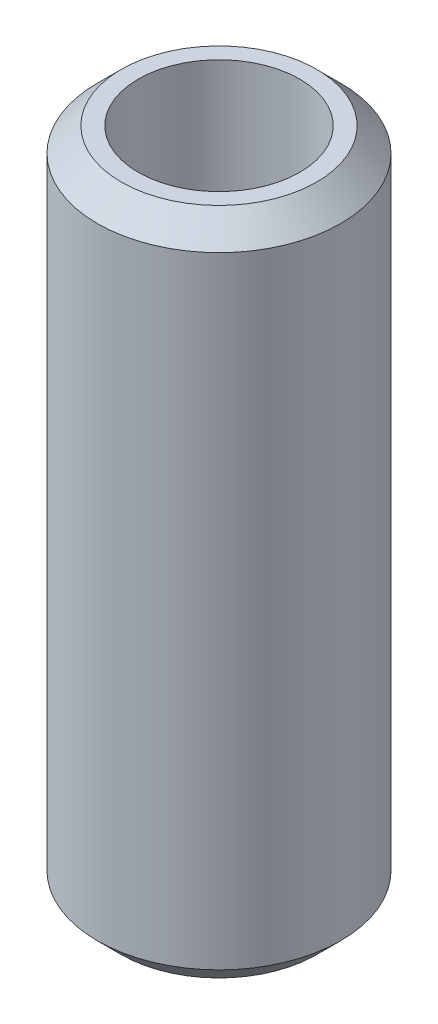
ISO-10303-21;
HEADER;
FILE_DESCRIPTION(('STEP AP214'),'2;1');
FILE_NAME('part.step','',(''),(''),'','','');
FILE_SCHEMA(('AUTOMOTIVE_DESIGN { 1 0 10303 214 1 1 1 1 }'));
ENDSEC;
DATA;
#1=APPLICATION_CONTEXT('core data for automotive mechanical design processes');
#2=APPLICATION_PROTOCOL_DEFINITION('international standard','automotive_design',2000,#1);
#3=PRODUCT_CONTEXT('',#1,'mechanical');
#4=PRODUCT('Part','Part','',(#3));
#5=PRODUCT_RELATED_PRODUCT_CATEGORY('part','',(#4));
#6=PRODUCT_DEFINITION_FORMATION('','',#4);
#7=PRODUCT_DEFINITION_CONTEXT('part definition',#1,'design');
#8=PRODUCT_DEFINITION('design','',#6,#7);
#9=PRODUCT_DEFINITION_SHAPE('','',#8);
#10=(LENGTH_UNIT() NAMED_UNIT(*) SI_UNIT(.MILLI.,.METRE.));
#11=(NAMED_UNIT(*) PLANE_ANGLE_UNIT() SI_UNIT($,.RADIAN.));
#12=(NAMED_UNIT(*) SI_UNIT($,.STERADIAN.) SOLID_ANGLE_UNIT());
#13=UNCERTAINTY_MEASURE_WITH_UNIT(LENGTH_MEASURE(1.E-05),#10,'distance_accuracy_value','');
#14=(GEOMETRIC_REPRESENTATION_CONTEXT(3) GLOBAL_UNCERTAINTY_ASSIGNED_CONTEXT((#13)) GLOBAL_UNIT_ASSIGNED_CONTEXT((#10,
#11,#12)) REPRESENTATION_CONTEXT('',''));
#15=CARTESIAN_POINT('',(0.,0.,0.));
#16=DIRECTION('',(0.,0.,1.));
#17=DIRECTION('',(1.,0.,0.));
#18=AXIS2_PLACEMENT_3D('',#15,#16,#17);
#19=CARTESIAN_POINT('',(0.,34.925,0.));
#20=DIRECTION('',(0.,1.,0.));
#21=DIRECTION('',(0.,0.,1.));
#22=AXIS2_PLACEMENT_3D('',#19,#20,#21);
#23=PLANE('',#22);
#24=CARTESIAN_POINT('',(0.,34.925,0.));
#25=DIRECTION('',(0.,1.,0.));
#26=DIRECTION('',(0.,0.,1.));
#27=AXIS2_PLACEMENT_3D('',#24,#25,#26);
#28=CIRCLE('',#27,10.2);
#29=CARTESIAN_POINT('',(0.,34.925,10.2));
#30=VERTEX_POINT('',#29);
#31=EDGE_CURVE('E10',#30,#30,#28,.T.);
#32=ORIENTED_EDGE('',*,*,#31,.T.);
#33=EDGE_LOOP('',(#32));
#34=FACE_BOUND('',#33,.T.);
#35=CARTESIAN_POINT('',(0.,34.925,0.));
#36=DIRECTION('',(0.,1.,0.));
#37=DIRECTION('',(0.,0.,1.));
#38=AXIS2_PLACEMENT_3D('',#35,#36,#37);
#39=CIRCLE('',#38,8.43397683397684);
#40=CARTESIAN_POINT('',(0.,34.925,8.43397683397684));
#41=VERTEX_POINT('',#40);
#42=EDGE_CURVE('E60',#41,#41,#39,.T.);
#43=ORIENTED_EDGE('',*,*,#42,.F.);
#44=EDGE_LOOP('',(#43));
#45=FACE_BOUND('',#44,.T.);
#46=ADVANCED_FACE('F39',(#34,#45),#23,.T.);
#47=CARTESIAN_POINT('',(0.,-34.925,0.));
#48=DIRECTION('',(0.,1.,0.));
#49=DIRECTION('',(0.,0.,1.));
#50=AXIS2_PLACEMENT_3D('',#47,#48,#49);
#51=PLANE('',#50);
#52=CARTESIAN_POINT('',(0.,-34.925,0.));
#53=DIRECTION('',(0.,1.,0.));
#54=DIRECTION('',(0.,0.,1.));
#55=AXIS2_PLACEMENT_3D('',#52,#53,#54);
#56=CIRCLE('',#55,10.2);
#57=CARTESIAN_POINT('',(0.,-34.925,10.2));
#58=VERTEX_POINT('',#57);
#59=EDGE_CURVE('E47',#58,#58,#56,.F.);
#60=ORIENTED_EDGE('',*,*,#59,.T.);
#61=EDGE_LOOP('',(#60));
#62=FACE_BOUND('',#61,.T.);
#63=CARTESIAN_POINT('',(0.,-34.925,0.));
#64=DIRECTION('',(0.,1.,0.));
#65=DIRECTION('',(0.,0.,1.));
#66=AXIS2_PLACEMENT_3D('',#63,#64,#65);
#67=CIRCLE('',#66,8.43397683397684);
#68=CARTESIAN_POINT('',(0.,-34.925,8.43397683397684));
#69=VERTEX_POINT('',#68);
#70=EDGE_CURVE('E61',#69,#69,#67,.T.);
#71=ORIENTED_EDGE('',*,*,#70,.T.);
#72=EDGE_LOOP('',(#71));
#73=FACE_BOUND('',#72,.T.);
#74=ADVANCED_FACE('F71',(#62,#73),#51,.F.);
#75=CARTESIAN_POINT('',(0.,34.925,0.));
#76=DIRECTION('',(0.,-1.,0.));
#77=DIRECTION('',(0.,0.,-1.));
#78=AXIS2_PLACEMENT_3D('',#75,#76,#77);
#79=CYLINDRICAL_SURFACE('',#78,12.7);
#80=CARTESIAN_POINT('',(0.,-32.425,0.));
#81=DIRECTION('',(0.,1.,0.));
#82=DIRECTION('',(0.,0.,1.));
#83=AXIS2_PLACEMENT_3D('',#80,#81,#82);
#84=CIRCLE('',#83,12.7);
#85=CARTESIAN_POINT('',(0.,-32.425,12.7));
#86=VERTEX_POINT('',#85);
#87=EDGE_CURVE('E51',#86,#86,#84,.T.);
#88=ORIENTED_EDGE('',*,*,#87,.T.);
#89=EDGE_LOOP('',(#88));
#90=FACE_BOUND('',#89,.T.);
#91=CARTESIAN_POINT('',(0.,32.425,0.));
#92=DIRECTION('',(0.,1.,0.));
#93=DIRECTION('',(0.,0.,1.));
#94=AXIS2_PLACEMENT_3D('',#91,#92,#93);
#95=CIRCLE('',#94,12.7);
#96=CARTESIAN_POINT('',(0.,32.425,12.7));
#97=VERTEX_POINT('',#96);
#98=EDGE_CURVE('E55',#97,#97,#95,.F.);
#99=ORIENTED_EDGE('',*,*,#98,.T.);
#100=EDGE_LOOP('',(#99));
#101=FACE_BOUND('',#100,.T.);
#102=ADVANCED_FACE('F76',(#90,#101),#79,.T.);
#103=CARTESIAN_POINT('',(0.,34.925,0.));
#104=DIRECTION('',(0.,-1.,0.));
#105=DIRECTION('',(0.,0.,-1.));
#106=AXIS2_PLACEMENT_3D('',#103,#104,#105);
#107=CYLINDRICAL_SURFACE('',#106,8.43397683397684);
#108=ORIENTED_EDGE('',*,*,#42,.T.);
#109=EDGE_LOOP('',(#108));
#110=FACE_BOUND('',#109,.T.);
#111=ORIENTED_EDGE('',*,*,#70,.F.);
#112=EDGE_LOOP('',(#111));
#113=FACE_BOUND('',#112,.T.);
#114=ADVANCED_FACE('F67',(#110,#113),#107,.F.);
#115=CARTESIAN_POINT('',(0.,-32.425,0.));
#116=DIRECTION('',(0.,1.,0.));
#117=DIRECTION('',(0.,0.,1.));
#118=AXIS2_PLACEMENT_3D('',#115,#116,#117);
#119=CONICAL_SURFACE('',#118,12.7,0.785398163397449);
#120=ORIENTED_EDGE('',*,*,#59,.F.);
#121=EDGE_LOOP('',(#120));
#122=FACE_BOUND('',#121,.T.);
#123=ORIENTED_EDGE('',*,*,#87,.F.);
#124=EDGE_LOOP('',(#123));
#125=FACE_BOUND('',#124,.T.);
#126=ADVANCED_FACE('F83',(#122,#125),#119,.T.);
#127=CARTESIAN_POINT('',(0.,34.925,0.));
#128=DIRECTION('',(0.,-1.,0.));
#129=DIRECTION('',(0.,0.,-1.));
#130=AXIS2_PLACEMENT_3D('',#127,#128,#129);
#131=CONICAL_SURFACE('',#130,10.2,0.785398163397446);
#132=ORIENTED_EDGE('',*,*,#98,.F.);
#133=EDGE_LOOP('',(#132));
#134=FACE_BOUND('',#133,.T.);
#135=ORIENTED_EDGE('',*,*,#31,.F.);
#136=EDGE_LOOP('',(#135));
#137=FACE_BOUND('',#136,.T.);
#138=ADVANCED_FACE('F42',(#134,#137),#131,.T.);
#139=CLOSED_SHELL('',(#46,#74,#102,#114,#126,#138));
#140=MANIFOLD_SOLID_BREP('B2',#139);
#141=ADVANCED_BREP_SHAPE_REPRESENTATION('',(#18,#140),#14);
#142=SHAPE_DEFINITION_REPRESENTATION(#9,#141);
ENDSEC;
END-ISO-10303-21;
